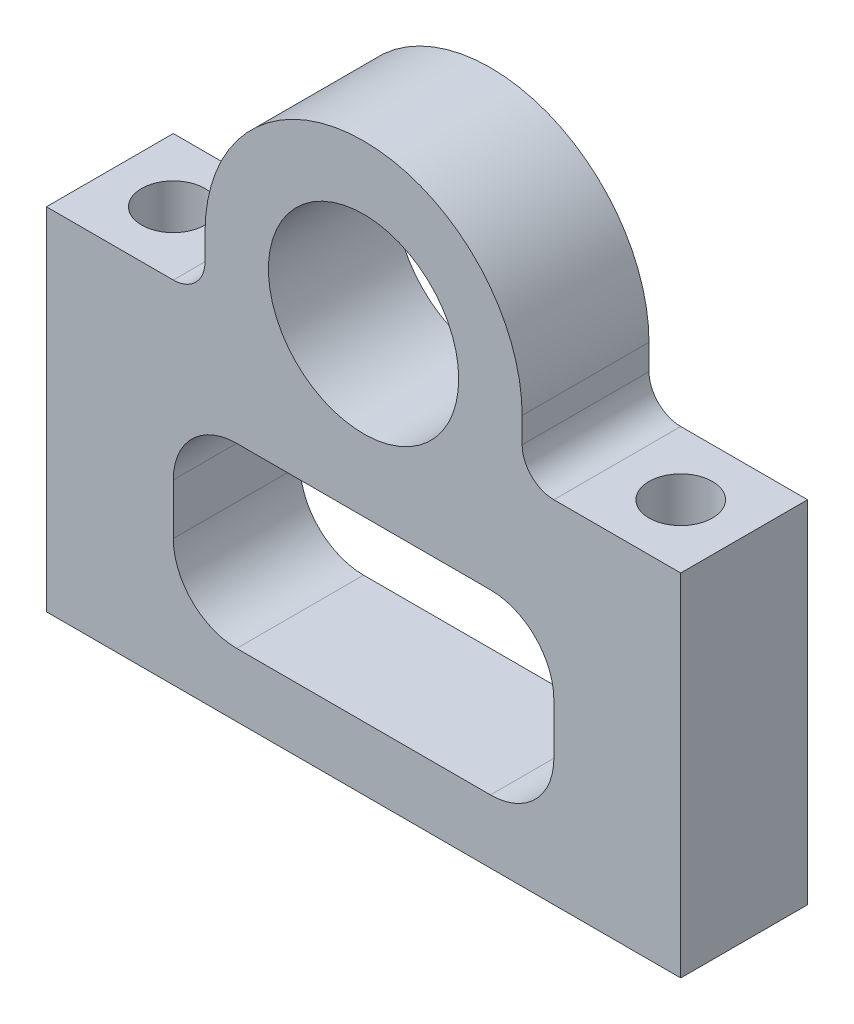
ISO-10303-21;
HEADER;
FILE_DESCRIPTION(('STEP AP214'),'2;1');
FILE_NAME('part.step','',(''),(''),'','','');
FILE_SCHEMA(('AUTOMOTIVE_DESIGN { 1 0 10303 214 1 1 1 1 }'));
ENDSEC;
DATA;
#1=APPLICATION_CONTEXT('core data for automotive mechanical design processes');
#2=APPLICATION_PROTOCOL_DEFINITION('international standard','automotive_design',2000,#1);
#3=PRODUCT_CONTEXT('',#1,'mechanical');
#4=PRODUCT('Part','Part','',(#3));
#5=PRODUCT_RELATED_PRODUCT_CATEGORY('part','',(#4));
#6=PRODUCT_DEFINITION_FORMATION('','',#4);
#7=PRODUCT_DEFINITION_CONTEXT('part definition',#1,'design');
#8=PRODUCT_DEFINITION('design','',#6,#7);
#9=PRODUCT_DEFINITION_SHAPE('','',#8);
#10=(LENGTH_UNIT() NAMED_UNIT(*) SI_UNIT(.MILLI.,.METRE.));
#11=(NAMED_UNIT(*) PLANE_ANGLE_UNIT() SI_UNIT($,.RADIAN.));
#12=(NAMED_UNIT(*) SI_UNIT($,.STERADIAN.) SOLID_ANGLE_UNIT());
#13=UNCERTAINTY_MEASURE_WITH_UNIT(LENGTH_MEASURE(1.E-05),#10,'distance_accuracy_value','');
#14=(GEOMETRIC_REPRESENTATION_CONTEXT(3) GLOBAL_UNCERTAINTY_ASSIGNED_CONTEXT((#13)) GLOBAL_UNIT_ASSIGNED_CONTEXT((#10,
#11,#12)) REPRESENTATION_CONTEXT('',''));
#15=CARTESIAN_POINT('',(0.,0.,0.));
#16=DIRECTION('',(0.,0.,1.));
#17=DIRECTION('',(1.,0.,0.));
#18=AXIS2_PLACEMENT_3D('',#15,#16,#17);
#19=CARTESIAN_POINT('',(15.,12.5,10.));
#20=DIRECTION('',(0.,0.,-1.));
#21=DIRECTION('',(-1.,0.,0.));
#22=AXIS2_PLACEMENT_3D('',#19,#20,#21);
#23=PLANE('',#22);
#24=DIRECTION('',(-1.,0.,0.));
#25=VECTOR('',#24,1.);
#26=CARTESIAN_POINT('',(9.99999999999996,1.35,10.));
#27=LINE('',#26,#25);
#28=CARTESIAN_POINT('',(9.99999999999996,1.34999999999999,10.));
#29=VERTEX_POINT('',#28);
#30=CARTESIAN_POINT('',(-9.99999999999997,1.34999999999999,10.));
#31=VERTEX_POINT('',#30);
#32=EDGE_CURVE('E169',#29,#31,#27,.T.);
#33=ORIENTED_EDGE('',*,*,#32,.F.);
#34=CARTESIAN_POINT('',(10.,-3.65,10.));
#35=DIRECTION('',(0.,0.,1.));
#36=DIRECTION('',(-1.,0.,0.));
#37=AXIS2_PLACEMENT_3D('',#34,#35,#36);
#38=CIRCLE('',#37,5.);
#39=CARTESIAN_POINT('',(15.,-3.65000000000004,10.));
#40=VERTEX_POINT('',#39);
#41=EDGE_CURVE('E48',#40,#29,#38,.T.);
#42=ORIENTED_EDGE('',*,*,#41,.F.);
#43=DIRECTION('',(0.,1.,0.));
#44=VECTOR('',#43,1.);
#45=CARTESIAN_POINT('',(15.,-3.65000000000004,10.));
#46=LINE('',#45,#44);
#47=CARTESIAN_POINT('',(15.,-7.64999999999997,10.));
#48=VERTEX_POINT('',#47);
#49=EDGE_CURVE('E190',#48,#40,#46,.T.);
#50=ORIENTED_EDGE('',*,*,#49,.F.);
#51=CARTESIAN_POINT('',(10.,-7.65,10.));
#52=DIRECTION('',(0.,0.,1.));
#53=DIRECTION('',(-1.,0.,0.));
#54=AXIS2_PLACEMENT_3D('',#51,#52,#53);
#55=CIRCLE('',#54,5.);
#56=CARTESIAN_POINT('',(9.99999999999996,-12.65,10.));
#57=VERTEX_POINT('',#56);
#58=EDGE_CURVE('E187',#57,#48,#55,.T.);
#59=ORIENTED_EDGE('',*,*,#58,.F.);
#60=DIRECTION('',(1.,0.,0.));
#61=VECTOR('',#60,1.);
#62=CARTESIAN_POINT('',(9.99999999999996,-12.65,10.));
#63=LINE('',#62,#61);
#64=CARTESIAN_POINT('',(-9.99999999999997,-12.65,10.));
#65=VERTEX_POINT('',#64);
#66=EDGE_CURVE('E184',#65,#57,#63,.T.);
#67=ORIENTED_EDGE('',*,*,#66,.F.);
#68=CARTESIAN_POINT('',(-10.,-7.65000000000001,10.));
#69=DIRECTION('',(0.,0.,1.));
#70=DIRECTION('',(-1.,0.,0.));
#71=AXIS2_PLACEMENT_3D('',#68,#69,#70);
#72=CIRCLE('',#71,5.);
#73=CARTESIAN_POINT('',(-15.,-7.64999999999997,10.));
#74=VERTEX_POINT('',#73);
#75=EDGE_CURVE('E178',#74,#65,#72,.T.);
#76=ORIENTED_EDGE('',*,*,#75,.F.);
#77=DIRECTION('',(0.,-1.,0.));
#78=VECTOR('',#77,1.);
#79=CARTESIAN_POINT('',(-15.,-3.65000000000004,10.));
#80=LINE('',#79,#78);
#81=CARTESIAN_POINT('',(-15.,-3.65000000000004,10.));
#82=VERTEX_POINT('',#81);
#83=EDGE_CURVE('E176',#82,#74,#80,.T.);
#84=ORIENTED_EDGE('',*,*,#83,.F.);
#85=CARTESIAN_POINT('',(-10.,-3.65000000000001,10.));
#86=DIRECTION('',(0.,0.,1.));
#87=DIRECTION('',(-1.,0.,0.));
#88=AXIS2_PLACEMENT_3D('',#85,#86,#87);
#89=CIRCLE('',#88,5.);
#90=EDGE_CURVE('E160',#31,#82,#89,.T.);
#91=ORIENTED_EDGE('',*,*,#90,.F.);
#92=EDGE_LOOP('',(#33,#42,#50,#59,#67,#76,#84,#91));
#93=FACE_BOUND('',#92,.T.);
#94=DIRECTION('',(0.,-1.,0.));
#95=VECTOR('',#94,1.);
#96=CARTESIAN_POINT('',(-25.,10.,10.));
#97=LINE('',#96,#95);
#98=CARTESIAN_POINT('',(-25.,10.,10.));
#99=VERTEX_POINT('',#98);
#100=CARTESIAN_POINT('',(-25.,-17.65,10.));
#101=VERTEX_POINT('',#100);
#102=EDGE_CURVE('E253',#99,#101,#97,.T.);
#103=ORIENTED_EDGE('',*,*,#102,.T.);
#104=DIRECTION('',(-1.,0.,0.));
#105=VECTOR('',#104,1.);
#106=CARTESIAN_POINT('',(-25.,-17.65,10.));
#107=LINE('',#106,#105);
#108=CARTESIAN_POINT('',(25.,-17.65,10.));
#109=VERTEX_POINT('',#108);
#110=EDGE_CURVE('E220',#109,#101,#107,.T.);
#111=ORIENTED_EDGE('',*,*,#110,.F.);
#112=DIRECTION('',(0.,1.,0.));
#113=VECTOR('',#112,1.);
#114=CARTESIAN_POINT('',(25.,10.,10.));
#115=LINE('',#114,#113);
#116=CARTESIAN_POINT('',(25.,10.,10.));
#117=VERTEX_POINT('',#116);
#118=EDGE_CURVE('E236',#109,#117,#115,.T.);
#119=ORIENTED_EDGE('',*,*,#118,.T.);
#120=DIRECTION('',(-1.,0.,0.));
#121=VECTOR('',#120,1.);
#122=CARTESIAN_POINT('',(15.,10.,10.));
#123=LINE('',#122,#121);
#124=CARTESIAN_POINT('',(15.,10.,10.));
#125=VERTEX_POINT('',#124);
#126=EDGE_CURVE('E238',#117,#125,#123,.T.);
#127=ORIENTED_EDGE('',*,*,#126,.T.);
#128=CARTESIAN_POINT('',(15.,12.5,10.));
#129=DIRECTION('',(0.,0.,-1.));
#130=DIRECTION('',(-1.,0.,0.));
#131=AXIS2_PLACEMENT_3D('',#128,#129,#130);
#132=CIRCLE('',#131,2.5);
#133=CARTESIAN_POINT('',(12.5,12.5,10.));
#134=VERTEX_POINT('',#133);
#135=EDGE_CURVE('E241',#125,#134,#132,.T.);
#136=ORIENTED_EDGE('',*,*,#135,.T.);
#137=DIRECTION('',(0.,1.,0.));
#138=VECTOR('',#137,1.);
#139=CARTESIAN_POINT('',(12.5,12.5,10.));
#140=LINE('',#139,#138);
#141=CARTESIAN_POINT('',(12.5,14.5,10.));
#142=VERTEX_POINT('',#141);
#143=EDGE_CURVE('E243',#134,#142,#140,.T.);
#144=ORIENTED_EDGE('',*,*,#143,.T.);
#145=CARTESIAN_POINT('',(0.,14.5,10.));
#146=DIRECTION('',(0.,0.,1.));
#147=DIRECTION('',(1.,0.,0.));
#148=AXIS2_PLACEMENT_3D('',#145,#146,#147);
#149=CIRCLE('',#148,12.5);
#150=CARTESIAN_POINT('',(-12.5,14.5,10.));
#151=VERTEX_POINT('',#150);
#152=EDGE_CURVE('E245',#142,#151,#149,.T.);
#153=ORIENTED_EDGE('',*,*,#152,.T.);
#154=DIRECTION('',(0.,-1.,0.));
#155=VECTOR('',#154,1.);
#156=CARTESIAN_POINT('',(-12.5,12.5,10.));
#157=LINE('',#156,#155);
#158=CARTESIAN_POINT('',(-12.5,12.5,10.));
#159=VERTEX_POINT('',#158);
#160=EDGE_CURVE('E247',#151,#159,#157,.T.);
#161=ORIENTED_EDGE('',*,*,#160,.T.);
#162=CARTESIAN_POINT('',(-15.,12.5,10.));
#163=DIRECTION('',(0.,0.,-1.));
#164=DIRECTION('',(1.,0.,0.));
#165=AXIS2_PLACEMENT_3D('',#162,#163,#164);
#166=CIRCLE('',#165,2.5);
#167=CARTESIAN_POINT('',(-15.,10.,10.));
#168=VERTEX_POINT('',#167);
#169=EDGE_CURVE('E249',#159,#168,#166,.T.);
#170=ORIENTED_EDGE('',*,*,#169,.T.);
#171=DIRECTION('',(-1.,0.,0.));
#172=VECTOR('',#171,1.);
#173=CARTESIAN_POINT('',(-15.,10.,10.));
#174=LINE('',#173,#172);
#175=EDGE_CURVE('E251',#168,#99,#174,.T.);
#176=ORIENTED_EDGE('',*,*,#175,.T.);
#177=EDGE_LOOP('',(#103,#111,#119,#127,#136,#144,#153,#161,#170,#176));
#178=FACE_BOUND('',#177,.T.);
#179=CARTESIAN_POINT('',(0.,14.5,10.));
#180=DIRECTION('',(0.,0.,1.));
#181=DIRECTION('',(1.,0.,0.));
#182=AXIS2_PLACEMENT_3D('',#179,#180,#181);
#183=CIRCLE('',#182,7.5);
#184=CARTESIAN_POINT('',(7.5,14.5,10.));
#185=VERTEX_POINT('',#184);
#186=EDGE_CURVE('E230',#185,#185,#183,.T.);
#187=ORIENTED_EDGE('',*,*,#186,.F.);
#188=EDGE_LOOP('',(#187));
#189=FACE_BOUND('',#188,.T.);
#190=ADVANCED_FACE('F33',(#93,#178,#189),#23,.F.);
#191=CARTESIAN_POINT('',(15.,12.5,0.));
#192=DIRECTION('',(0.,0.,-1.));
#193=DIRECTION('',(-1.,0.,0.));
#194=AXIS2_PLACEMENT_3D('',#191,#192,#193);
#195=PLANE('',#194);
#196=CARTESIAN_POINT('',(10.,-3.65,0.));
#197=DIRECTION('',(0.,0.,-1.));
#198=DIRECTION('',(-1.,0.,0.));
#199=AXIS2_PLACEMENT_3D('',#196,#197,#198);
#200=CIRCLE('',#199,5.);
#201=CARTESIAN_POINT('',(9.99999999999996,1.35,0.));
#202=VERTEX_POINT('',#201);
#203=CARTESIAN_POINT('',(15.,-3.65000000000004,0.));
#204=VERTEX_POINT('',#203);
#205=EDGE_CURVE('E11',#202,#204,#200,.T.);
#206=ORIENTED_EDGE('',*,*,#205,.F.);
#207=DIRECTION('',(1.,0.,0.));
#208=VECTOR('',#207,1.);
#209=CARTESIAN_POINT('',(15.,1.35,0.));
#210=LINE('',#209,#208);
#211=CARTESIAN_POINT('',(-9.99999999999997,1.34999999999999,0.));
#212=VERTEX_POINT('',#211);
#213=EDGE_CURVE('E295',#212,#202,#210,.T.);
#214=ORIENTED_EDGE('',*,*,#213,.F.);
#215=CARTESIAN_POINT('',(-10.,-3.65000000000001,0.));
#216=DIRECTION('',(0.,0.,-1.));
#217=DIRECTION('',(-1.,0.,0.));
#218=AXIS2_PLACEMENT_3D('',#215,#216,#217);
#219=CIRCLE('',#218,5.);
#220=CARTESIAN_POINT('',(-15.,-3.65000000000004,0.));
#221=VERTEX_POINT('',#220);
#222=EDGE_CURVE('E163',#221,#212,#219,.T.);
#223=ORIENTED_EDGE('',*,*,#222,.F.);
#224=DIRECTION('',(0.,1.,0.));
#225=VECTOR('',#224,1.);
#226=CARTESIAN_POINT('',(-15.,12.5,0.));
#227=LINE('',#226,#225);
#228=CARTESIAN_POINT('',(-15.,-7.64999999999997,0.));
#229=VERTEX_POINT('',#228);
#230=EDGE_CURVE('E298',#229,#221,#227,.T.);
#231=ORIENTED_EDGE('',*,*,#230,.F.);
#232=CARTESIAN_POINT('',(-10.,-7.65000000000001,0.));
#233=DIRECTION('',(0.,0.,-1.));
#234=DIRECTION('',(-1.,0.,0.));
#235=AXIS2_PLACEMENT_3D('',#232,#233,#234);
#236=CIRCLE('',#235,5.);
#237=CARTESIAN_POINT('',(-9.99999999999997,-12.65,0.));
#238=VERTEX_POINT('',#237);
#239=EDGE_CURVE('E300',#238,#229,#236,.T.);
#240=ORIENTED_EDGE('',*,*,#239,.F.);
#241=DIRECTION('',(-1.,0.,0.));
#242=VECTOR('',#241,1.);
#243=CARTESIAN_POINT('',(15.,-12.65,0.));
#244=LINE('',#243,#242);
#245=CARTESIAN_POINT('',(9.99999999999996,-12.65,0.));
#246=VERTEX_POINT('',#245);
#247=EDGE_CURVE('E302',#246,#238,#244,.T.);
#248=ORIENTED_EDGE('',*,*,#247,.F.);
#249=CARTESIAN_POINT('',(10.,-7.65,0.));
#250=DIRECTION('',(0.,0.,-1.));
#251=DIRECTION('',(-1.,0.,0.));
#252=AXIS2_PLACEMENT_3D('',#249,#250,#251);
#253=CIRCLE('',#252,5.);
#254=CARTESIAN_POINT('',(15.,-7.64999999999997,0.));
#255=VERTEX_POINT('',#254);
#256=EDGE_CURVE('E304',#255,#246,#253,.T.);
#257=ORIENTED_EDGE('',*,*,#256,.F.);
#258=DIRECTION('',(0.,-1.,0.));
#259=VECTOR('',#258,1.);
#260=CARTESIAN_POINT('',(15.,12.5,0.));
#261=LINE('',#260,#259);
#262=EDGE_CURVE('E41',#204,#255,#261,.T.);
#263=ORIENTED_EDGE('',*,*,#262,.F.);
#264=EDGE_LOOP('',(#206,#214,#223,#231,#240,#248,#257,#263));
#265=FACE_BOUND('',#264,.T.);
#266=DIRECTION('',(0.,1.,0.));
#267=VECTOR('',#266,1.);
#268=CARTESIAN_POINT('',(25.,10.,0.));
#269=LINE('',#268,#267);
#270=CARTESIAN_POINT('',(25.,-17.65,0.));
#271=VERTEX_POINT('',#270);
#272=CARTESIAN_POINT('',(25.,10.,0.));
#273=VERTEX_POINT('',#272);
#274=EDGE_CURVE('E233',#271,#273,#269,.T.);
#275=ORIENTED_EDGE('',*,*,#274,.F.);
#276=DIRECTION('',(1.,0.,0.));
#277=VECTOR('',#276,1.);
#278=CARTESIAN_POINT('',(-25.,-17.65,0.));
#279=LINE('',#278,#277);
#280=CARTESIAN_POINT('',(-25.,-17.65,0.));
#281=VERTEX_POINT('',#280);
#282=EDGE_CURVE('E214',#281,#271,#279,.T.);
#283=ORIENTED_EDGE('',*,*,#282,.F.);
#284=DIRECTION('',(0.,-1.,0.));
#285=VECTOR('',#284,1.);
#286=CARTESIAN_POINT('',(-25.,10.,0.));
#287=LINE('',#286,#285);
#288=CARTESIAN_POINT('',(-25.,10.,0.));
#289=VERTEX_POINT('',#288);
#290=EDGE_CURVE('E239',#289,#281,#287,.T.);
#291=ORIENTED_EDGE('',*,*,#290,.F.);
#292=DIRECTION('',(-1.,0.,0.));
#293=VECTOR('',#292,1.);
#294=CARTESIAN_POINT('',(-15.,10.,0.));
#295=LINE('',#294,#293);
#296=CARTESIAN_POINT('',(-15.,10.,0.));
#297=VERTEX_POINT('',#296);
#298=EDGE_CURVE('E269',#297,#289,#295,.T.);
#299=ORIENTED_EDGE('',*,*,#298,.F.);
#300=CARTESIAN_POINT('',(-15.,12.5,0.));
#301=DIRECTION('',(0.,0.,-1.));
#302=DIRECTION('',(1.,0.,0.));
#303=AXIS2_PLACEMENT_3D('',#300,#301,#302);
#304=CIRCLE('',#303,2.5);
#305=CARTESIAN_POINT('',(-12.5,12.5,0.));
#306=VERTEX_POINT('',#305);
#307=EDGE_CURVE('E267',#306,#297,#304,.T.);
#308=ORIENTED_EDGE('',*,*,#307,.F.);
#309=DIRECTION('',(0.,-1.,0.));
#310=VECTOR('',#309,1.);
#311=CARTESIAN_POINT('',(-12.5,12.5,0.));
#312=LINE('',#311,#310);
#313=CARTESIAN_POINT('',(-12.5,14.5,0.));
#314=VERTEX_POINT('',#313);
#315=EDGE_CURVE('E265',#314,#306,#312,.T.);
#316=ORIENTED_EDGE('',*,*,#315,.F.);
#317=CARTESIAN_POINT('',(0.,14.5,0.));
#318=DIRECTION('',(0.,0.,1.));
#319=DIRECTION('',(1.,0.,0.));
#320=AXIS2_PLACEMENT_3D('',#317,#318,#319);
#321=CIRCLE('',#320,12.5);
#322=CARTESIAN_POINT('',(12.5,14.5,0.));
#323=VERTEX_POINT('',#322);
#324=EDGE_CURVE('E263',#323,#314,#321,.T.);
#325=ORIENTED_EDGE('',*,*,#324,.F.);
#326=DIRECTION('',(0.,1.,0.));
#327=VECTOR('',#326,1.);
#328=CARTESIAN_POINT('',(12.5,12.5,0.));
#329=LINE('',#328,#327);
#330=CARTESIAN_POINT('',(12.5,12.5,0.));
#331=VERTEX_POINT('',#330);
#332=EDGE_CURVE('E261',#331,#323,#329,.T.);
#333=ORIENTED_EDGE('',*,*,#332,.F.);
#334=CARTESIAN_POINT('',(15.,12.5,0.));
#335=DIRECTION('',(0.,0.,-1.));
#336=DIRECTION('',(-1.,0.,0.));
#337=AXIS2_PLACEMENT_3D('',#334,#335,#336);
#338=CIRCLE('',#337,2.5);
#339=CARTESIAN_POINT('',(15.,10.,0.));
#340=VERTEX_POINT('',#339);
#341=EDGE_CURVE('E259',#340,#331,#338,.T.);
#342=ORIENTED_EDGE('',*,*,#341,.F.);
#343=DIRECTION('',(-1.,0.,0.));
#344=VECTOR('',#343,1.);
#345=CARTESIAN_POINT('',(15.,10.,0.));
#346=LINE('',#345,#344);
#347=EDGE_CURVE('E257',#273,#340,#346,.T.);
#348=ORIENTED_EDGE('',*,*,#347,.F.);
#349=EDGE_LOOP('',(#275,#283,#291,#299,#308,#316,#325,#333,#342,#348));
#350=FACE_BOUND('',#349,.T.);
#351=CARTESIAN_POINT('',(0.,14.5,0.));
#352=DIRECTION('',(0.,0.,1.));
#353=DIRECTION('',(1.,0.,0.));
#354=AXIS2_PLACEMENT_3D('',#351,#352,#353);
#355=CIRCLE('',#354,7.5);
#356=CARTESIAN_POINT('',(7.5,14.5,0.));
#357=VERTEX_POINT('',#356);
#358=EDGE_CURVE('E229',#357,#357,#355,.T.);
#359=ORIENTED_EDGE('',*,*,#358,.T.);
#360=EDGE_LOOP('',(#359));
#361=FACE_BOUND('',#360,.T.);
#362=ADVANCED_FACE('F319',(#265,#350,#361),#195,.T.);
#363=CARTESIAN_POINT('',(25.,10.,10.));
#364=DIRECTION('',(-1.,0.,0.));
#365=DIRECTION('',(0.,0.,1.));
#366=AXIS2_PLACEMENT_3D('',#363,#364,#365);
#367=PLANE('',#366);
#368=ORIENTED_EDGE('',*,*,#274,.T.);
#369=DIRECTION('',(0.,0.,-1.));
#370=VECTOR('',#369,1.);
#371=CARTESIAN_POINT('',(25.,10.,10.));
#372=LINE('',#371,#370);
#373=EDGE_CURVE('E292',#117,#273,#372,.T.);
#374=ORIENTED_EDGE('',*,*,#373,.F.);
#375=ORIENTED_EDGE('',*,*,#118,.F.);
#376=DIRECTION('',(0.,0.,1.));
#377=VECTOR('',#376,1.);
#378=CARTESIAN_POINT('',(25.,-17.65,10.));
#379=LINE('',#378,#377);
#380=EDGE_CURVE('E217',#271,#109,#379,.T.);
#381=ORIENTED_EDGE('',*,*,#380,.F.);
#382=EDGE_LOOP('',(#368,#374,#375,#381));
#383=FACE_BOUND('',#382,.T.);
#384=ADVANCED_FACE('F35',(#383),#367,.F.);
#385=CARTESIAN_POINT('',(15.,10.,10.));
#386=DIRECTION('',(0.,-1.,0.));
#387=DIRECTION('',(0.,0.,-1.));
#388=AXIS2_PLACEMENT_3D('',#385,#386,#387);
#389=PLANE('',#388);
#390=CARTESIAN_POINT('',(20.,10.,5.));
#391=DIRECTION('',(0.,1.,0.));
#392=DIRECTION('',(0.,0.,-1.));
#393=AXIS2_PLACEMENT_3D('',#390,#391,#392);
#394=CIRCLE('',#393,2.5);
#395=CARTESIAN_POINT('',(20.,10.,2.5));
#396=VERTEX_POINT('',#395);
#397=EDGE_CURVE('E223',#396,#396,#394,.T.);
#398=ORIENTED_EDGE('',*,*,#397,.F.);
#399=EDGE_LOOP('',(#398));
#400=FACE_BOUND('',#399,.T.);
#401=ORIENTED_EDGE('',*,*,#347,.T.);
#402=DIRECTION('',(0.,0.,-1.));
#403=VECTOR('',#402,1.);
#404=CARTESIAN_POINT('',(15.,10.,10.));
#405=LINE('',#404,#403);
#406=EDGE_CURVE('E289',#125,#340,#405,.T.);
#407=ORIENTED_EDGE('',*,*,#406,.F.);
#408=ORIENTED_EDGE('',*,*,#126,.F.);
#409=ORIENTED_EDGE('',*,*,#373,.T.);
#410=EDGE_LOOP('',(#401,#407,#408,#409));
#411=FACE_BOUND('',#410,.T.);
#412=ADVANCED_FACE('F382',(#400,#411),#389,.F.);
#413=CARTESIAN_POINT('',(15.,12.5,10.));
#414=DIRECTION('',(0.,0.,-1.));
#415=DIRECTION('',(-1.,0.,0.));
#416=AXIS2_PLACEMENT_3D('',#413,#414,#415);
#417=CYLINDRICAL_SURFACE('',#416,2.5);
#418=ORIENTED_EDGE('',*,*,#341,.T.);
#419=DIRECTION('',(0.,0.,-1.));
#420=VECTOR('',#419,1.);
#421=CARTESIAN_POINT('',(12.5,12.5,10.));
#422=LINE('',#421,#420);
#423=EDGE_CURVE('E286',#134,#331,#422,.T.);
#424=ORIENTED_EDGE('',*,*,#423,.F.);
#425=ORIENTED_EDGE('',*,*,#135,.F.);
#426=ORIENTED_EDGE('',*,*,#406,.T.);
#427=EDGE_LOOP('',(#418,#424,#425,#426));
#428=FACE_BOUND('',#427,.T.);
#429=ADVANCED_FACE('F379',(#428),#417,.F.);
#430=CARTESIAN_POINT('',(12.5,12.5,10.));
#431=DIRECTION('',(-1.,0.,0.));
#432=DIRECTION('',(0.,0.,1.));
#433=AXIS2_PLACEMENT_3D('',#430,#431,#432);
#434=PLANE('',#433);
#435=ORIENTED_EDGE('',*,*,#332,.T.);
#436=DIRECTION('',(0.,0.,-1.));
#437=VECTOR('',#436,1.);
#438=CARTESIAN_POINT('',(12.5,14.5,10.));
#439=LINE('',#438,#437);
#440=EDGE_CURVE('E283',#142,#323,#439,.T.);
#441=ORIENTED_EDGE('',*,*,#440,.F.);
#442=ORIENTED_EDGE('',*,*,#143,.F.);
#443=ORIENTED_EDGE('',*,*,#423,.T.);
#444=EDGE_LOOP('',(#435,#441,#442,#443));
#445=FACE_BOUND('',#444,.T.);
#446=ADVANCED_FACE('F375',(#445),#434,.F.);
#447=CARTESIAN_POINT('',(0.,14.5,10.));
#448=DIRECTION('',(0.,0.,-1.));
#449=DIRECTION('',(-1.,0.,0.));
#450=AXIS2_PLACEMENT_3D('',#447,#448,#449);
#451=CYLINDRICAL_SURFACE('',#450,12.5);
#452=ORIENTED_EDGE('',*,*,#324,.T.);
#453=DIRECTION('',(0.,0.,-1.));
#454=VECTOR('',#453,1.);
#455=CARTESIAN_POINT('',(-12.5,14.5,10.));
#456=LINE('',#455,#454);
#457=EDGE_CURVE('E280',#151,#314,#456,.T.);
#458=ORIENTED_EDGE('',*,*,#457,.F.);
#459=ORIENTED_EDGE('',*,*,#152,.F.);
#460=ORIENTED_EDGE('',*,*,#440,.T.);
#461=EDGE_LOOP('',(#452,#458,#459,#460));
#462=FACE_BOUND('',#461,.T.);
#463=ADVANCED_FACE('F371',(#462),#451,.T.);
#464=CARTESIAN_POINT('',(-12.5,12.5,10.));
#465=DIRECTION('',(1.,0.,0.));
#466=DIRECTION('',(0.,0.,-1.));
#467=AXIS2_PLACEMENT_3D('',#464,#465,#466);
#468=PLANE('',#467);
#469=ORIENTED_EDGE('',*,*,#315,.T.);
#470=DIRECTION('',(0.,0.,-1.));
#471=VECTOR('',#470,1.);
#472=CARTESIAN_POINT('',(-12.5,12.5,10.));
#473=LINE('',#472,#471);
#474=EDGE_CURVE('E277',#159,#306,#473,.T.);
#475=ORIENTED_EDGE('',*,*,#474,.F.);
#476=ORIENTED_EDGE('',*,*,#160,.F.);
#477=ORIENTED_EDGE('',*,*,#457,.T.);
#478=EDGE_LOOP('',(#469,#475,#476,#477));
#479=FACE_BOUND('',#478,.T.);
#480=ADVANCED_FACE('F367',(#479),#468,.F.);
#481=CARTESIAN_POINT('',(-15.,12.5,10.));
#482=DIRECTION('',(0.,0.,-1.));
#483=DIRECTION('',(-1.,0.,0.));
#484=AXIS2_PLACEMENT_3D('',#481,#482,#483);
#485=CYLINDRICAL_SURFACE('',#484,2.5);
#486=ORIENTED_EDGE('',*,*,#307,.T.);
#487=DIRECTION('',(0.,0.,-1.));
#488=VECTOR('',#487,1.);
#489=CARTESIAN_POINT('',(-15.,10.,10.));
#490=LINE('',#489,#488);
#491=EDGE_CURVE('E274',#168,#297,#490,.T.);
#492=ORIENTED_EDGE('',*,*,#491,.F.);
#493=ORIENTED_EDGE('',*,*,#169,.F.);
#494=ORIENTED_EDGE('',*,*,#474,.T.);
#495=EDGE_LOOP('',(#486,#492,#493,#494));
#496=FACE_BOUND('',#495,.T.);
#497=ADVANCED_FACE('F363',(#496),#485,.F.);
#498=CARTESIAN_POINT('',(-15.,10.,10.));
#499=DIRECTION('',(0.,-1.,0.));
#500=DIRECTION('',(0.,0.,-1.));
#501=AXIS2_PLACEMENT_3D('',#498,#499,#500);
#502=PLANE('',#501);
#503=CARTESIAN_POINT('',(-20.,10.,5.));
#504=DIRECTION('',(0.,1.,0.));
#505=DIRECTION('',(0.,0.,1.));
#506=AXIS2_PLACEMENT_3D('',#503,#504,#505);
#507=CIRCLE('',#506,2.5);
#508=CARTESIAN_POINT('',(-20.,10.,7.5));
#509=VERTEX_POINT('',#508);
#510=EDGE_CURVE('E226',#509,#509,#507,.T.);
#511=ORIENTED_EDGE('',*,*,#510,.F.);
#512=EDGE_LOOP('',(#511));
#513=FACE_BOUND('',#512,.T.);
#514=ORIENTED_EDGE('',*,*,#298,.T.);
#515=DIRECTION('',(0.,0.,-1.));
#516=VECTOR('',#515,1.);
#517=CARTESIAN_POINT('',(-25.,10.,10.));
#518=LINE('',#517,#516);
#519=EDGE_CURVE('E255',#99,#289,#518,.T.);
#520=ORIENTED_EDGE('',*,*,#519,.F.);
#521=ORIENTED_EDGE('',*,*,#175,.F.);
#522=ORIENTED_EDGE('',*,*,#491,.T.);
#523=EDGE_LOOP('',(#514,#520,#521,#522));
#524=FACE_BOUND('',#523,.T.);
#525=ADVANCED_FACE('F359',(#513,#524),#502,.F.);
#526=CARTESIAN_POINT('',(-25.,10.,10.));
#527=DIRECTION('',(1.,0.,0.));
#528=DIRECTION('',(0.,0.,-1.));
#529=AXIS2_PLACEMENT_3D('',#526,#527,#528);
#530=PLANE('',#529);
#531=ORIENTED_EDGE('',*,*,#290,.T.);
#532=DIRECTION('',(0.,0.,-1.));
#533=VECTOR('',#532,1.);
#534=CARTESIAN_POINT('',(-25.,-17.65,10.));
#535=LINE('',#534,#533);
#536=EDGE_CURVE('E211',#101,#281,#535,.T.);
#537=ORIENTED_EDGE('',*,*,#536,.F.);
#538=ORIENTED_EDGE('',*,*,#102,.F.);
#539=ORIENTED_EDGE('',*,*,#519,.T.);
#540=EDGE_LOOP('',(#531,#537,#538,#539));
#541=FACE_BOUND('',#540,.T.);
#542=ADVANCED_FACE('F356',(#541),#530,.F.);
#543=CARTESIAN_POINT('',(0.,14.5,10.));
#544=DIRECTION('',(0.,0.,-1.));
#545=DIRECTION('',(-1.,0.,0.));
#546=AXIS2_PLACEMENT_3D('',#543,#544,#545);
#547=CYLINDRICAL_SURFACE('',#546,7.5);
#548=ORIENTED_EDGE('',*,*,#186,.T.);
#549=EDGE_LOOP('',(#548));
#550=FACE_BOUND('',#549,.T.);
#551=ORIENTED_EDGE('',*,*,#358,.F.);
#552=EDGE_LOOP('',(#551));
#553=FACE_BOUND('',#552,.T.);
#554=ADVANCED_FACE('F353',(#550,#553),#547,.F.);
#555=CARTESIAN_POINT('',(-20.,-10.,5.));
#556=DIRECTION('',(0.,1.,0.));
#557=DIRECTION('',(0.,0.,1.));
#558=AXIS2_PLACEMENT_3D('',#555,#556,#557);
#559=CYLINDRICAL_SURFACE('',#558,2.5);
#560=ORIENTED_EDGE('',*,*,#510,.T.);
#561=EDGE_LOOP('',(#560));
#562=FACE_BOUND('',#561,.T.);
#563=CARTESIAN_POINT('',(-20.,-17.65,5.));
#564=DIRECTION('',(0.,-1.,0.));
#565=DIRECTION('',(1.,0.,0.));
#566=AXIS2_PLACEMENT_3D('',#563,#564,#565);
#567=CIRCLE('',#566,2.5);
#568=CARTESIAN_POINT('',(-17.5,-17.65,5.));
#569=VERTEX_POINT('',#568);
#570=EDGE_CURVE('E208',#569,#569,#567,.T.);
#571=ORIENTED_EDGE('',*,*,#570,.T.);
#572=EDGE_LOOP('',(#571));
#573=FACE_BOUND('',#572,.T.);
#574=ADVANCED_FACE('F429',(#562,#573),#559,.F.);
#575=CARTESIAN_POINT('',(20.,-10.,5.));
#576=DIRECTION('',(0.,1.,0.));
#577=DIRECTION('',(0.,0.,1.));
#578=AXIS2_PLACEMENT_3D('',#575,#576,#577);
#579=CYLINDRICAL_SURFACE('',#578,2.5);
#580=ORIENTED_EDGE('',*,*,#397,.T.);
#581=EDGE_LOOP('',(#580));
#582=FACE_BOUND('',#581,.T.);
#583=CARTESIAN_POINT('',(20.,-17.65,5.));
#584=DIRECTION('',(0.,-1.,0.));
#585=DIRECTION('',(1.,0.,0.));
#586=AXIS2_PLACEMENT_3D('',#583,#584,#585);
#587=CIRCLE('',#586,2.5);
#588=CARTESIAN_POINT('',(22.5,-17.65,5.));
#589=VERTEX_POINT('',#588);
#590=EDGE_CURVE('E195',#589,#589,#587,.T.);
#591=ORIENTED_EDGE('',*,*,#590,.T.);
#592=EDGE_LOOP('',(#591));
#593=FACE_BOUND('',#592,.T.);
#594=ADVANCED_FACE('F341',(#582,#593),#579,.F.);
#595=CARTESIAN_POINT('',(0.,-17.65,0.));
#596=DIRECTION('',(0.,-1.,0.));
#597=DIRECTION('',(1.,0.,0.));
#598=AXIS2_PLACEMENT_3D('',#595,#596,#597);
#599=PLANE('',#598);
#600=ORIENTED_EDGE('',*,*,#570,.F.);
#601=EDGE_LOOP('',(#600));
#602=FACE_BOUND('',#601,.T.);
#603=ORIENTED_EDGE('',*,*,#536,.T.);
#604=ORIENTED_EDGE('',*,*,#282,.T.);
#605=ORIENTED_EDGE('',*,*,#380,.T.);
#606=ORIENTED_EDGE('',*,*,#110,.T.);
#607=EDGE_LOOP('',(#603,#604,#605,#606));
#608=FACE_BOUND('',#607,.T.);
#609=ORIENTED_EDGE('',*,*,#590,.F.);
#610=EDGE_LOOP('',(#609));
#611=FACE_BOUND('',#610,.T.);
#612=ADVANCED_FACE('F334',(#602,#608,#611),#599,.T.);
#613=CARTESIAN_POINT('',(10.,-3.65,-7.65));
#614=DIRECTION('',(0.,0.,1.));
#615=DIRECTION('',(1.,0.,0.));
#616=AXIS2_PLACEMENT_3D('',#613,#614,#615);
#617=CYLINDRICAL_SURFACE('',#616,5.);
#618=ORIENTED_EDGE('',*,*,#205,.T.);
#619=DIRECTION('',(0.,0.,1.));
#620=VECTOR('',#619,1.);
#621=CARTESIAN_POINT('',(15.,-3.65000000000004,-7.65));
#622=LINE('',#621,#620);
#623=EDGE_CURVE('E193',#204,#40,#622,.T.);
#624=ORIENTED_EDGE('',*,*,#623,.T.);
#625=ORIENTED_EDGE('',*,*,#41,.T.);
#626=DIRECTION('',(0.,0.,1.));
#627=VECTOR('',#626,1.);
#628=CARTESIAN_POINT('',(9.99999999999996,1.35,-7.65));
#629=LINE('',#628,#627);
#630=EDGE_CURVE('E166',#202,#29,#629,.T.);
#631=ORIENTED_EDGE('',*,*,#630,.F.);
#632=EDGE_LOOP('',(#618,#624,#625,#631));
#633=FACE_BOUND('',#632,.T.);
#634=ADVANCED_FACE('F332',(#633),#617,.F.);
#635=CARTESIAN_POINT('',(15.,-3.65000000000004,-7.65));
#636=DIRECTION('',(1.,0.,0.));
#637=DIRECTION('',(0.,0.,-1.));
#638=AXIS2_PLACEMENT_3D('',#635,#636,#637);
#639=PLANE('',#638);
#640=ORIENTED_EDGE('',*,*,#262,.T.);
#641=DIRECTION('',(0.,0.,1.));
#642=VECTOR('',#641,1.);
#643=CARTESIAN_POINT('',(15.,-7.64999999999997,-7.65));
#644=LINE('',#643,#642);
#645=EDGE_CURVE('E196',#255,#48,#644,.T.);
#646=ORIENTED_EDGE('',*,*,#645,.T.);
#647=ORIENTED_EDGE('',*,*,#49,.T.);
#648=ORIENTED_EDGE('',*,*,#623,.F.);
#649=EDGE_LOOP('',(#640,#646,#647,#648));
#650=FACE_BOUND('',#649,.T.);
#651=ADVANCED_FACE('F309',(#650),#639,.F.);
#652=CARTESIAN_POINT('',(10.,-7.65,-7.65));
#653=DIRECTION('',(0.,0.,1.));
#654=DIRECTION('',(1.,0.,0.));
#655=AXIS2_PLACEMENT_3D('',#652,#653,#654);
#656=CYLINDRICAL_SURFACE('',#655,5.);
#657=ORIENTED_EDGE('',*,*,#256,.T.);
#658=DIRECTION('',(0.,0.,1.));
#659=VECTOR('',#658,1.);
#660=CARTESIAN_POINT('',(9.99999999999996,-12.65,-7.65));
#661=LINE('',#660,#659);
#662=EDGE_CURVE('E198',#246,#57,#661,.T.);
#663=ORIENTED_EDGE('',*,*,#662,.T.);
#664=ORIENTED_EDGE('',*,*,#58,.T.);
#665=ORIENTED_EDGE('',*,*,#645,.F.);
#666=EDGE_LOOP('',(#657,#663,#664,#665));
#667=FACE_BOUND('',#666,.T.);
#668=ADVANCED_FACE('F314',(#667),#656,.F.);
#669=CARTESIAN_POINT('',(9.99999999999996,-12.65,-7.65));
#670=DIRECTION('',(0.,-1.,0.));
#671=DIRECTION('',(1.,0.,0.));
#672=AXIS2_PLACEMENT_3D('',#669,#670,#671);
#673=PLANE('',#672);
#674=ORIENTED_EDGE('',*,*,#247,.T.);
#675=DIRECTION('',(0.,0.,1.));
#676=VECTOR('',#675,1.);
#677=CARTESIAN_POINT('',(-9.99999999999997,-12.65,-7.65));
#678=LINE('',#677,#676);
#679=EDGE_CURVE('E200',#238,#65,#678,.T.);
#680=ORIENTED_EDGE('',*,*,#679,.T.);
#681=ORIENTED_EDGE('',*,*,#66,.T.);
#682=ORIENTED_EDGE('',*,*,#662,.F.);
#683=EDGE_LOOP('',(#674,#680,#681,#682));
#684=FACE_BOUND('',#683,.T.);
#685=ADVANCED_FACE('F325',(#684),#673,.F.);
#686=CARTESIAN_POINT('',(-10.,-7.65000000000001,-7.65));
#687=DIRECTION('',(0.,0.,1.));
#688=DIRECTION('',(1.,0.,0.));
#689=AXIS2_PLACEMENT_3D('',#686,#687,#688);
#690=CYLINDRICAL_SURFACE('',#689,5.);
#691=ORIENTED_EDGE('',*,*,#239,.T.);
#692=DIRECTION('',(0.,0.,1.));
#693=VECTOR('',#692,1.);
#694=CARTESIAN_POINT('',(-15.,-7.64999999999997,-7.65));
#695=LINE('',#694,#693);
#696=EDGE_CURVE('E202',#229,#74,#695,.T.);
#697=ORIENTED_EDGE('',*,*,#696,.T.);
#698=ORIENTED_EDGE('',*,*,#75,.T.);
#699=ORIENTED_EDGE('',*,*,#679,.F.);
#700=EDGE_LOOP('',(#691,#697,#698,#699));
#701=FACE_BOUND('',#700,.T.);
#702=ADVANCED_FACE('F327',(#701),#690,.F.);
#703=CARTESIAN_POINT('',(-15.,-3.65000000000004,-7.65));
#704=DIRECTION('',(-1.,0.,0.));
#705=DIRECTION('',(0.,0.,1.));
#706=AXIS2_PLACEMENT_3D('',#703,#704,#705);
#707=PLANE('',#706);
#708=ORIENTED_EDGE('',*,*,#230,.T.);
#709=DIRECTION('',(0.,0.,1.));
#710=VECTOR('',#709,1.);
#711=CARTESIAN_POINT('',(-15.,-3.65000000000004,-7.65));
#712=LINE('',#711,#710);
#713=EDGE_CURVE('E165',#221,#82,#712,.T.);
#714=ORIENTED_EDGE('',*,*,#713,.T.);
#715=ORIENTED_EDGE('',*,*,#83,.T.);
#716=ORIENTED_EDGE('',*,*,#696,.F.);
#717=EDGE_LOOP('',(#708,#714,#715,#716));
#718=FACE_BOUND('',#717,.T.);
#719=ADVANCED_FACE('F331',(#718),#707,.F.);
#720=CARTESIAN_POINT('',(-10.,-3.65000000000001,-7.65));
#721=DIRECTION('',(0.,0.,1.));
#722=DIRECTION('',(1.,0.,0.));
#723=AXIS2_PLACEMENT_3D('',#720,#721,#722);
#724=CYLINDRICAL_SURFACE('',#723,5.);
#725=ORIENTED_EDGE('',*,*,#222,.T.);
#726=DIRECTION('',(0.,0.,1.));
#727=VECTOR('',#726,1.);
#728=CARTESIAN_POINT('',(-9.99999999999997,1.34999999999999,-7.65));
#729=LINE('',#728,#727);
#730=EDGE_CURVE('E56',#212,#31,#729,.T.);
#731=ORIENTED_EDGE('',*,*,#730,.T.);
#732=ORIENTED_EDGE('',*,*,#90,.T.);
#733=ORIENTED_EDGE('',*,*,#713,.F.);
#734=EDGE_LOOP('',(#725,#731,#732,#733));
#735=FACE_BOUND('',#734,.T.);
#736=ADVANCED_FACE('F157',(#735),#724,.F.);
#737=CARTESIAN_POINT('',(9.99999999999996,1.35,-7.65));
#738=DIRECTION('',(0.,1.,0.));
#739=DIRECTION('',(-1.,0.,0.));
#740=AXIS2_PLACEMENT_3D('',#737,#738,#739);
#741=PLANE('',#740);
#742=ORIENTED_EDGE('',*,*,#213,.T.);
#743=ORIENTED_EDGE('',*,*,#630,.T.);
#744=ORIENTED_EDGE('',*,*,#32,.T.);
#745=ORIENTED_EDGE('',*,*,#730,.F.);
#746=EDGE_LOOP('',(#742,#743,#744,#745));
#747=FACE_BOUND('',#746,.T.);
#748=ADVANCED_FACE('F170',(#747),#741,.F.);
#749=CLOSED_SHELL('',(#190,#362,#384,#412,#429,#446,#463,#480,#497,#525,#542,#554,#574,#594,
#612,#634,#651,#668,#685,#702,#719,#736,#748));
#750=MANIFOLD_SOLID_BREP('B2',#749);
#751=ADVANCED_BREP_SHAPE_REPRESENTATION('',(#18,#750),#14);
#752=SHAPE_DEFINITION_REPRESENTATION(#9,#751);
ENDSEC;
END-ISO-10303-21;
